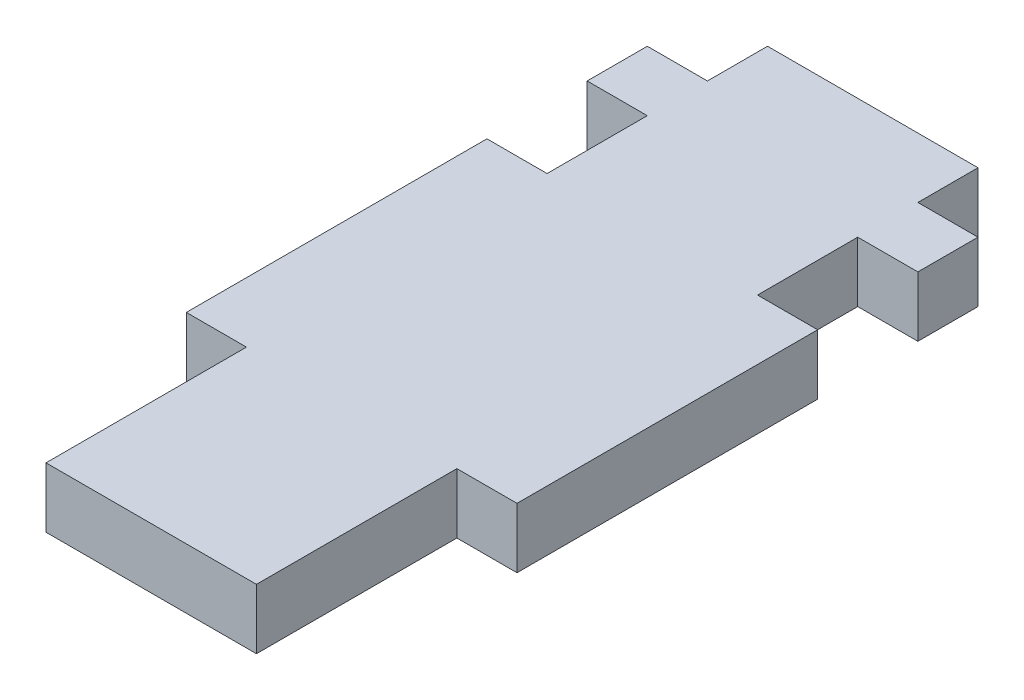
ISO-10303-21;
HEADER;
FILE_DESCRIPTION(('STEP AP214'),'2;1');
FILE_NAME('part.step','',(''),(''),'','','');
FILE_SCHEMA(('AUTOMOTIVE_DESIGN { 1 0 10303 214 1 1 1 1 }'));
ENDSEC;
DATA;
#1=APPLICATION_CONTEXT('core data for automotive mechanical design processes');
#2=APPLICATION_PROTOCOL_DEFINITION('international standard','automotive_design',2000,#1);
#3=PRODUCT_CONTEXT('',#1,'mechanical');
#4=PRODUCT('Part','Part','',(#3));
#5=PRODUCT_RELATED_PRODUCT_CATEGORY('part','',(#4));
#6=PRODUCT_DEFINITION_FORMATION('','',#4);
#7=PRODUCT_DEFINITION_CONTEXT('part definition',#1,'design');
#8=PRODUCT_DEFINITION('design','',#6,#7);
#9=PRODUCT_DEFINITION_SHAPE('','',#8);
#10=(LENGTH_UNIT() NAMED_UNIT(*) SI_UNIT(.MILLI.,.METRE.));
#11=(NAMED_UNIT(*) PLANE_ANGLE_UNIT() SI_UNIT($,.RADIAN.));
#12=(NAMED_UNIT(*) SI_UNIT($,.STERADIAN.) SOLID_ANGLE_UNIT());
#13=UNCERTAINTY_MEASURE_WITH_UNIT(LENGTH_MEASURE(1.E-05),#10,'distance_accuracy_value','');
#14=(GEOMETRIC_REPRESENTATION_CONTEXT(3) GLOBAL_UNCERTAINTY_ASSIGNED_CONTEXT((#13)) GLOBAL_UNIT_ASSIGNED_CONTEXT((#10,
#11,#12)) REPRESENTATION_CONTEXT('',''));
#15=CARTESIAN_POINT('',(0.,0.,0.));
#16=DIRECTION('',(0.,0.,1.));
#17=DIRECTION('',(1.,0.,0.));
#18=AXIS2_PLACEMENT_3D('',#15,#16,#17);
#19=CARTESIAN_POINT('',(13.5,3.,0.));
#20=DIRECTION('',(1.,0.,0.));
#21=DIRECTION('',(0.,0.,-1.));
#22=AXIS2_PLACEMENT_3D('',#19,#20,#21);
#23=PLANE('',#22);
#24=DIRECTION('',(0.,0.,1.));
#25=VECTOR('',#24,1.);
#26=CARTESIAN_POINT('',(13.5,0.,0.));
#27=LINE('',#26,#25);
#28=CARTESIAN_POINT('',(13.5,0.,0.));
#29=VERTEX_POINT('',#28);
#30=CARTESIAN_POINT('',(13.5,0.,5.));
#31=VERTEX_POINT('',#30);
#32=EDGE_CURVE('E217',#29,#31,#27,.T.);
#33=ORIENTED_EDGE('',*,*,#32,.F.);
#34=DIRECTION('',(0.,-1.,0.));
#35=VECTOR('',#34,1.);
#36=CARTESIAN_POINT('',(13.5,3.,0.));
#37=LINE('',#36,#35);
#38=CARTESIAN_POINT('',(13.5,3.,0.));
#39=VERTEX_POINT('',#38);
#40=EDGE_CURVE('E11',#39,#29,#37,.T.);
#41=ORIENTED_EDGE('',*,*,#40,.F.);
#42=DIRECTION('',(0.,0.,1.));
#43=VECTOR('',#42,1.);
#44=CARTESIAN_POINT('',(13.5,3.,0.));
#45=LINE('',#44,#43);
#46=CARTESIAN_POINT('',(13.5,3.,5.));
#47=VERTEX_POINT('',#46);
#48=EDGE_CURVE('E284',#39,#47,#45,.T.);
#49=ORIENTED_EDGE('',*,*,#48,.T.);
#50=DIRECTION('',(0.,-1.,0.));
#51=VECTOR('',#50,1.);
#52=CARTESIAN_POINT('',(13.5,3.,5.));
#53=LINE('',#52,#51);
#54=EDGE_CURVE('E134',#47,#31,#53,.T.);
#55=ORIENTED_EDGE('',*,*,#54,.T.);
#56=EDGE_LOOP('',(#33,#41,#49,#55));
#57=FACE_BOUND('',#56,.T.);
#58=ADVANCED_FACE('F47',(#57),#23,.T.);
#59=CARTESIAN_POINT('',(0.,3.,0.));
#60=DIRECTION('',(0.,0.,-1.));
#61=DIRECTION('',(-1.,0.,0.));
#62=AXIS2_PLACEMENT_3D('',#59,#60,#61);
#63=PLANE('',#62);
#64=DIRECTION('',(1.,0.,0.));
#65=VECTOR('',#64,1.);
#66=CARTESIAN_POINT('',(0.,0.,0.));
#67=LINE('',#66,#65);
#68=CARTESIAN_POINT('',(16.5,0.,0.));
#69=VERTEX_POINT('',#68);
#70=EDGE_CURVE('E221',#29,#69,#67,.T.);
#71=ORIENTED_EDGE('',*,*,#70,.T.);
#72=DIRECTION('',(0.,-1.,0.));
#73=VECTOR('',#72,1.);
#74=CARTESIAN_POINT('',(16.5,3.,0.));
#75=LINE('',#74,#73);
#76=CARTESIAN_POINT('',(16.5,3.,0.));
#77=VERTEX_POINT('',#76);
#78=EDGE_CURVE('E56',#77,#69,#75,.T.);
#79=ORIENTED_EDGE('',*,*,#78,.F.);
#80=DIRECTION('',(1.,0.,0.));
#81=VECTOR('',#80,1.);
#82=CARTESIAN_POINT('',(0.,3.,0.));
#83=LINE('',#82,#81);
#84=EDGE_CURVE('E364',#39,#77,#83,.T.);
#85=ORIENTED_EDGE('',*,*,#84,.F.);
#86=ORIENTED_EDGE('',*,*,#40,.T.);
#87=EDGE_LOOP('',(#71,#79,#85,#86));
#88=FACE_BOUND('',#87,.T.);
#89=ADVANCED_FACE('F414',(#88),#63,.F.);
#90=CARTESIAN_POINT('',(16.5,3.,0.));
#91=DIRECTION('',(-1.,0.,0.));
#92=DIRECTION('',(0.,0.,1.));
#93=AXIS2_PLACEMENT_3D('',#90,#91,#92);
#94=PLANE('',#93);
#95=DIRECTION('',(0.,0.,-1.));
#96=VECTOR('',#95,1.);
#97=CARTESIAN_POINT('',(16.5,0.,0.));
#98=LINE('',#97,#96);
#99=CARTESIAN_POINT('',(16.5,0.,-3.));
#100=VERTEX_POINT('',#99);
#101=EDGE_CURVE('E224',#69,#100,#98,.T.);
#102=ORIENTED_EDGE('',*,*,#101,.T.);
#103=DIRECTION('',(0.,-1.,0.));
#104=VECTOR('',#103,1.);
#105=CARTESIAN_POINT('',(16.5,3.,-3.));
#106=LINE('',#105,#104);
#107=CARTESIAN_POINT('',(16.5,3.,-3.));
#108=VERTEX_POINT('',#107);
#109=EDGE_CURVE('E333',#108,#100,#106,.T.);
#110=ORIENTED_EDGE('',*,*,#109,.F.);
#111=DIRECTION('',(0.,0.,-1.));
#112=VECTOR('',#111,1.);
#113=CARTESIAN_POINT('',(16.5,3.,0.));
#114=LINE('',#113,#112);
#115=EDGE_CURVE('E343',#77,#108,#114,.T.);
#116=ORIENTED_EDGE('',*,*,#115,.F.);
#117=ORIENTED_EDGE('',*,*,#78,.T.);
#118=EDGE_LOOP('',(#102,#110,#116,#117));
#119=FACE_BOUND('',#118,.T.);
#120=ADVANCED_FACE('F341',(#119),#94,.F.);
#121=CARTESIAN_POINT('',(0.,3.,-3.));
#122=DIRECTION('',(0.,0.,-1.));
#123=DIRECTION('',(-1.,0.,0.));
#124=AXIS2_PLACEMENT_3D('',#121,#122,#123);
#125=PLANE('',#124);
#126=DIRECTION('',(1.,0.,0.));
#127=VECTOR('',#126,1.);
#128=CARTESIAN_POINT('',(0.,0.,-3.));
#129=LINE('',#128,#127);
#130=CARTESIAN_POINT('',(13.5,0.,-3.));
#131=VERTEX_POINT('',#130);
#132=EDGE_CURVE('E229',#131,#100,#129,.T.);
#133=ORIENTED_EDGE('',*,*,#132,.F.);
#134=DIRECTION('',(0.,-1.,0.));
#135=VECTOR('',#134,1.);
#136=CARTESIAN_POINT('',(13.5,3.,-3.));
#137=LINE('',#136,#135);
#138=CARTESIAN_POINT('',(13.5,3.,-3.));
#139=VERTEX_POINT('',#138);
#140=EDGE_CURVE('E330',#139,#131,#137,.T.);
#141=ORIENTED_EDGE('',*,*,#140,.F.);
#142=DIRECTION('',(1.,0.,0.));
#143=VECTOR('',#142,1.);
#144=CARTESIAN_POINT('',(0.,3.,-3.));
#145=LINE('',#144,#143);
#146=EDGE_CURVE('E355',#139,#108,#145,.T.);
#147=ORIENTED_EDGE('',*,*,#146,.T.);
#148=ORIENTED_EDGE('',*,*,#109,.T.);
#149=EDGE_LOOP('',(#133,#141,#147,#148));
#150=FACE_BOUND('',#149,.T.);
#151=ADVANCED_FACE('F351',(#150),#125,.T.);
#152=CARTESIAN_POINT('',(13.5,3.,0.));
#153=DIRECTION('',(-1.,0.,0.));
#154=DIRECTION('',(0.,0.,1.));
#155=AXIS2_PLACEMENT_3D('',#152,#153,#154);
#156=PLANE('',#155);
#157=DIRECTION('',(0.,0.,-1.));
#158=VECTOR('',#157,1.);
#159=CARTESIAN_POINT('',(13.5,0.,0.));
#160=LINE('',#159,#158);
#161=CARTESIAN_POINT('',(13.5,0.,-6.));
#162=VERTEX_POINT('',#161);
#163=EDGE_CURVE('E233',#131,#162,#160,.T.);
#164=ORIENTED_EDGE('',*,*,#163,.T.);
#165=DIRECTION('',(0.,-1.,0.));
#166=VECTOR('',#165,1.);
#167=CARTESIAN_POINT('',(13.5,3.,-6.));
#168=LINE('',#167,#166);
#169=CARTESIAN_POINT('',(13.5,3.,-6.));
#170=VERTEX_POINT('',#169);
#171=EDGE_CURVE('E327',#170,#162,#168,.T.);
#172=ORIENTED_EDGE('',*,*,#171,.F.);
#173=DIRECTION('',(0.,0.,-1.));
#174=VECTOR('',#173,1.);
#175=CARTESIAN_POINT('',(13.5,3.,0.));
#176=LINE('',#175,#174);
#177=EDGE_CURVE('E357',#139,#170,#176,.T.);
#178=ORIENTED_EDGE('',*,*,#177,.F.);
#179=ORIENTED_EDGE('',*,*,#140,.T.);
#180=EDGE_LOOP('',(#164,#172,#178,#179));
#181=FACE_BOUND('',#180,.T.);
#182=ADVANCED_FACE('F614',(#181),#156,.F.);
#183=CARTESIAN_POINT('',(0.,3.,-6.));
#184=DIRECTION('',(0.,0.,-1.));
#185=DIRECTION('',(-1.,0.,0.));
#186=AXIS2_PLACEMENT_3D('',#183,#184,#185);
#187=PLANE('',#186);
#188=DIRECTION('',(1.,0.,0.));
#189=VECTOR('',#188,1.);
#190=CARTESIAN_POINT('',(0.,0.,-6.));
#191=LINE('',#190,#189);
#192=CARTESIAN_POINT('',(3.,0.,-6.));
#193=VERTEX_POINT('',#192);
#194=EDGE_CURVE('E238',#193,#162,#191,.T.);
#195=ORIENTED_EDGE('',*,*,#194,.F.);
#196=DIRECTION('',(0.,-1.,0.));
#197=VECTOR('',#196,1.);
#198=CARTESIAN_POINT('',(3.,3.,-6.));
#199=LINE('',#198,#197);
#200=CARTESIAN_POINT('',(3.,3.,-6.));
#201=VERTEX_POINT('',#200);
#202=EDGE_CURVE('E324',#201,#193,#199,.T.);
#203=ORIENTED_EDGE('',*,*,#202,.F.);
#204=DIRECTION('',(1.,0.,0.));
#205=VECTOR('',#204,1.);
#206=CARTESIAN_POINT('',(0.,3.,-6.));
#207=LINE('',#206,#205);
#208=EDGE_CURVE('E362',#201,#170,#207,.T.);
#209=ORIENTED_EDGE('',*,*,#208,.T.);
#210=ORIENTED_EDGE('',*,*,#171,.T.);
#211=EDGE_LOOP('',(#195,#203,#209,#210));
#212=FACE_BOUND('',#211,.T.);
#213=ADVANCED_FACE('F606',(#212),#187,.T.);
#214=CARTESIAN_POINT('',(3.,3.,0.));
#215=DIRECTION('',(-1.,0.,0.));
#216=DIRECTION('',(0.,0.,1.));
#217=AXIS2_PLACEMENT_3D('',#214,#215,#216);
#218=PLANE('',#217);
#219=DIRECTION('',(0.,0.,-1.));
#220=VECTOR('',#219,1.);
#221=CARTESIAN_POINT('',(3.,0.,0.));
#222=LINE('',#221,#220);
#223=CARTESIAN_POINT('',(3.,0.,-3.));
#224=VERTEX_POINT('',#223);
#225=EDGE_CURVE('E242',#224,#193,#222,.T.);
#226=ORIENTED_EDGE('',*,*,#225,.F.);
#227=DIRECTION('',(0.,-1.,0.));
#228=VECTOR('',#227,1.);
#229=CARTESIAN_POINT('',(3.,3.,-3.));
#230=LINE('',#229,#228);
#231=CARTESIAN_POINT('',(3.,3.,-3.));
#232=VERTEX_POINT('',#231);
#233=EDGE_CURVE('E321',#232,#224,#230,.T.);
#234=ORIENTED_EDGE('',*,*,#233,.F.);
#235=DIRECTION('',(0.,0.,-1.));
#236=VECTOR('',#235,1.);
#237=CARTESIAN_POINT('',(3.,3.,0.));
#238=LINE('',#237,#236);
#239=EDGE_CURVE('E369',#232,#201,#238,.T.);
#240=ORIENTED_EDGE('',*,*,#239,.T.);
#241=ORIENTED_EDGE('',*,*,#202,.T.);
#242=EDGE_LOOP('',(#226,#234,#240,#241));
#243=FACE_BOUND('',#242,.T.);
#244=ADVANCED_FACE('F598',(#243),#218,.T.);
#245=CARTESIAN_POINT('',(0.,0.,-3.));
#246=VERTEX_POINT('',#245);
#247=EDGE_CURVE('E234',#246,#224,#129,.T.);
#248=ORIENTED_EDGE('',*,*,#247,.F.);
#249=DIRECTION('',(0.,-1.,0.));
#250=VECTOR('',#249,1.);
#251=CARTESIAN_POINT('',(0.,3.,-3.));
#252=LINE('',#251,#250);
#253=CARTESIAN_POINT('',(0.,3.,-3.));
#254=VERTEX_POINT('',#253);
#255=EDGE_CURVE('E318',#254,#246,#252,.T.);
#256=ORIENTED_EDGE('',*,*,#255,.F.);
#257=EDGE_CURVE('E359',#254,#232,#145,.T.);
#258=ORIENTED_EDGE('',*,*,#257,.T.);
#259=ORIENTED_EDGE('',*,*,#233,.T.);
#260=EDGE_LOOP('',(#248,#256,#258,#259));
#261=FACE_BOUND('',#260,.T.);
#262=ADVANCED_FACE('F435',(#261),#125,.T.);
#263=CARTESIAN_POINT('',(0.,3.,0.));
#264=DIRECTION('',(-1.,0.,0.));
#265=DIRECTION('',(0.,0.,1.));
#266=AXIS2_PLACEMENT_3D('',#263,#264,#265);
#267=PLANE('',#266);
#268=DIRECTION('',(0.,0.,-1.));
#269=VECTOR('',#268,1.);
#270=CARTESIAN_POINT('',(0.,0.,0.));
#271=LINE('',#270,#269);
#272=CARTESIAN_POINT('',(0.,0.,0.));
#273=VERTEX_POINT('',#272);
#274=EDGE_CURVE('E246',#273,#246,#271,.T.);
#275=ORIENTED_EDGE('',*,*,#274,.F.);
#276=DIRECTION('',(0.,-1.,0.));
#277=VECTOR('',#276,1.);
#278=CARTESIAN_POINT('',(0.,3.,0.));
#279=LINE('',#278,#277);
#280=CARTESIAN_POINT('',(0.,3.,0.));
#281=VERTEX_POINT('',#280);
#282=EDGE_CURVE('E315',#281,#273,#279,.T.);
#283=ORIENTED_EDGE('',*,*,#282,.F.);
#284=DIRECTION('',(0.,0.,-1.));
#285=VECTOR('',#284,1.);
#286=CARTESIAN_POINT('',(0.,3.,0.));
#287=LINE('',#286,#285);
#288=EDGE_CURVE('E368',#281,#254,#287,.T.);
#289=ORIENTED_EDGE('',*,*,#288,.T.);
#290=ORIENTED_EDGE('',*,*,#255,.T.);
#291=EDGE_LOOP('',(#275,#283,#289,#290));
#292=FACE_BOUND('',#291,.T.);
#293=ADVANCED_FACE('F427',(#292),#267,.T.);
#294=CARTESIAN_POINT('',(3.,0.,0.));
#295=VERTEX_POINT('',#294);
#296=EDGE_CURVE('E225',#273,#295,#67,.T.);
#297=ORIENTED_EDGE('',*,*,#296,.T.);
#298=DIRECTION('',(0.,-1.,0.));
#299=VECTOR('',#298,1.);
#300=CARTESIAN_POINT('',(3.,3.,0.));
#301=LINE('',#300,#299);
#302=CARTESIAN_POINT('',(3.,3.,0.));
#303=VERTEX_POINT('',#302);
#304=EDGE_CURVE('E311',#303,#295,#301,.T.);
#305=ORIENTED_EDGE('',*,*,#304,.F.);
#306=EDGE_CURVE('E375',#281,#303,#83,.T.);
#307=ORIENTED_EDGE('',*,*,#306,.F.);
#308=ORIENTED_EDGE('',*,*,#282,.T.);
#309=EDGE_LOOP('',(#297,#305,#307,#308));
#310=FACE_BOUND('',#309,.T.);
#311=ADVANCED_FACE('F419',(#310),#63,.F.);
#312=CARTESIAN_POINT('',(3.,3.,0.));
#313=DIRECTION('',(1.,0.,0.));
#314=DIRECTION('',(0.,0.,-1.));
#315=AXIS2_PLACEMENT_3D('',#312,#313,#314);
#316=PLANE('',#315);
#317=DIRECTION('',(0.,0.,1.));
#318=VECTOR('',#317,1.);
#319=CARTESIAN_POINT('',(3.,0.,0.));
#320=LINE('',#319,#318);
#321=CARTESIAN_POINT('',(3.,0.,5.));
#322=VERTEX_POINT('',#321);
#323=EDGE_CURVE('E250',#295,#322,#320,.T.);
#324=ORIENTED_EDGE('',*,*,#323,.T.);
#325=DIRECTION('',(0.,-1.,0.));
#326=VECTOR('',#325,1.);
#327=CARTESIAN_POINT('',(3.,3.,5.));
#328=LINE('',#327,#326);
#329=CARTESIAN_POINT('',(3.,3.,5.));
#330=VERTEX_POINT('',#329);
#331=EDGE_CURVE('E308',#330,#322,#328,.T.);
#332=ORIENTED_EDGE('',*,*,#331,.F.);
#333=DIRECTION('',(0.,0.,1.));
#334=VECTOR('',#333,1.);
#335=CARTESIAN_POINT('',(3.,3.,0.));
#336=LINE('',#335,#334);
#337=EDGE_CURVE('E385',#303,#330,#336,.T.);
#338=ORIENTED_EDGE('',*,*,#337,.F.);
#339=ORIENTED_EDGE('',*,*,#304,.T.);
#340=EDGE_LOOP('',(#324,#332,#338,#339));
#341=FACE_BOUND('',#340,.T.);
#342=ADVANCED_FACE('F426',(#341),#316,.F.);
#343=CARTESIAN_POINT('',(0.,3.,5.));
#344=DIRECTION('',(0.,0.,-1.));
#345=DIRECTION('',(-1.,0.,0.));
#346=AXIS2_PLACEMENT_3D('',#343,#344,#345);
#347=PLANE('',#346);
#348=DIRECTION('',(1.,0.,0.));
#349=VECTOR('',#348,1.);
#350=CARTESIAN_POINT('',(0.,0.,5.));
#351=LINE('',#350,#349);
#352=CARTESIAN_POINT('',(0.,0.,5.));
#353=VERTEX_POINT('',#352);
#354=EDGE_CURVE('E254',#353,#322,#351,.T.);
#355=ORIENTED_EDGE('',*,*,#354,.F.);
#356=DIRECTION('',(0.,-1.,0.));
#357=VECTOR('',#356,1.);
#358=CARTESIAN_POINT('',(0.,3.,5.));
#359=LINE('',#358,#357);
#360=CARTESIAN_POINT('',(0.,3.,5.));
#361=VERTEX_POINT('',#360);
#362=EDGE_CURVE('E305',#361,#353,#359,.T.);
#363=ORIENTED_EDGE('',*,*,#362,.F.);
#364=DIRECTION('',(1.,0.,0.));
#365=VECTOR('',#364,1.);
#366=CARTESIAN_POINT('',(0.,3.,5.));
#367=LINE('',#366,#365);
#368=EDGE_CURVE('E388',#361,#330,#367,.T.);
#369=ORIENTED_EDGE('',*,*,#368,.T.);
#370=ORIENTED_EDGE('',*,*,#331,.T.);
#371=EDGE_LOOP('',(#355,#363,#369,#370));
#372=FACE_BOUND('',#371,.T.);
#373=ADVANCED_FACE('F433',(#372),#347,.T.);
#374=CARTESIAN_POINT('',(0.,3.,0.));
#375=DIRECTION('',(1.,0.,0.));
#376=DIRECTION('',(0.,0.,-1.));
#377=AXIS2_PLACEMENT_3D('',#374,#375,#376);
#378=PLANE('',#377);
#379=DIRECTION('',(0.,0.,1.));
#380=VECTOR('',#379,1.);
#381=CARTESIAN_POINT('',(0.,0.,0.));
#382=LINE('',#381,#380);
#383=CARTESIAN_POINT('',(0.,0.,20.));
#384=VERTEX_POINT('',#383);
#385=EDGE_CURVE('E258',#353,#384,#382,.T.);
#386=ORIENTED_EDGE('',*,*,#385,.T.);
#387=DIRECTION('',(0.,-1.,0.));
#388=VECTOR('',#387,1.);
#389=CARTESIAN_POINT('',(0.,3.,20.));
#390=LINE('',#389,#388);
#391=CARTESIAN_POINT('',(0.,3.,20.));
#392=VERTEX_POINT('',#391);
#393=EDGE_CURVE('E301',#392,#384,#390,.T.);
#394=ORIENTED_EDGE('',*,*,#393,.F.);
#395=DIRECTION('',(0.,0.,1.));
#396=VECTOR('',#395,1.);
#397=CARTESIAN_POINT('',(0.,3.,0.));
#398=LINE('',#397,#396);
#399=EDGE_CURVE('E392',#361,#392,#398,.T.);
#400=ORIENTED_EDGE('',*,*,#399,.F.);
#401=ORIENTED_EDGE('',*,*,#362,.T.);
#402=EDGE_LOOP('',(#386,#394,#400,#401));
#403=FACE_BOUND('',#402,.T.);
#404=ADVANCED_FACE('F454',(#403),#378,.F.);
#405=CARTESIAN_POINT('',(0.,3.,20.));
#406=DIRECTION('',(0.,0.,-1.));
#407=DIRECTION('',(-1.,0.,0.));
#408=AXIS2_PLACEMENT_3D('',#405,#406,#407);
#409=PLANE('',#408);
#410=DIRECTION('',(1.,0.,0.));
#411=VECTOR('',#410,1.);
#412=CARTESIAN_POINT('',(0.,0.,20.));
#413=LINE('',#412,#411);
#414=CARTESIAN_POINT('',(3.,0.,20.));
#415=VERTEX_POINT('',#414);
#416=EDGE_CURVE('E261',#384,#415,#413,.T.);
#417=ORIENTED_EDGE('',*,*,#416,.T.);
#418=DIRECTION('',(0.,-1.,0.));
#419=VECTOR('',#418,1.);
#420=CARTESIAN_POINT('',(3.,3.,20.));
#421=LINE('',#420,#419);
#422=CARTESIAN_POINT('',(3.,3.,20.));
#423=VERTEX_POINT('',#422);
#424=EDGE_CURVE('E298',#423,#415,#421,.T.);
#425=ORIENTED_EDGE('',*,*,#424,.F.);
#426=DIRECTION('',(1.,0.,0.));
#427=VECTOR('',#426,1.);
#428=CARTESIAN_POINT('',(0.,3.,20.));
#429=LINE('',#428,#427);
#430=EDGE_CURVE('E395',#392,#423,#429,.T.);
#431=ORIENTED_EDGE('',*,*,#430,.F.);
#432=ORIENTED_EDGE('',*,*,#393,.T.);
#433=EDGE_LOOP('',(#417,#425,#431,#432));
#434=FACE_BOUND('',#433,.T.);
#435=ADVANCED_FACE('F456',(#434),#409,.F.);
#436=CARTESIAN_POINT('',(3.,3.,0.));
#437=DIRECTION('',(-1.,0.,0.));
#438=DIRECTION('',(0.,0.,1.));
#439=AXIS2_PLACEMENT_3D('',#436,#437,#438);
#440=PLANE('',#439);
#441=DIRECTION('',(0.,0.,-1.));
#442=VECTOR('',#441,1.);
#443=CARTESIAN_POINT('',(3.,0.,0.));
#444=LINE('',#443,#442);
#445=CARTESIAN_POINT('',(3.,0.,30.));
#446=VERTEX_POINT('',#445);
#447=EDGE_CURVE('E265',#446,#415,#444,.T.);
#448=ORIENTED_EDGE('',*,*,#447,.F.);
#449=DIRECTION('',(0.,-1.,0.));
#450=VECTOR('',#449,1.);
#451=CARTESIAN_POINT('',(3.,3.,30.));
#452=LINE('',#451,#450);
#453=CARTESIAN_POINT('',(3.,3.,30.));
#454=VERTEX_POINT('',#453);
#455=EDGE_CURVE('E295',#454,#446,#452,.T.);
#456=ORIENTED_EDGE('',*,*,#455,.F.);
#457=DIRECTION('',(0.,0.,-1.));
#458=VECTOR('',#457,1.);
#459=CARTESIAN_POINT('',(3.,3.,0.));
#460=LINE('',#459,#458);
#461=EDGE_CURVE('E398',#454,#423,#460,.T.);
#462=ORIENTED_EDGE('',*,*,#461,.T.);
#463=ORIENTED_EDGE('',*,*,#424,.T.);
#464=EDGE_LOOP('',(#448,#456,#462,#463));
#465=FACE_BOUND('',#464,.T.);
#466=ADVANCED_FACE('F459',(#465),#440,.T.);
#467=CARTESIAN_POINT('',(0.,3.,30.));
#468=DIRECTION('',(0.,0.,-1.));
#469=DIRECTION('',(-1.,0.,0.));
#470=AXIS2_PLACEMENT_3D('',#467,#468,#469);
#471=PLANE('',#470);
#472=DIRECTION('',(1.,0.,0.));
#473=VECTOR('',#472,1.);
#474=CARTESIAN_POINT('',(0.,0.,30.));
#475=LINE('',#474,#473);
#476=CARTESIAN_POINT('',(13.5,0.,30.));
#477=VERTEX_POINT('',#476);
#478=EDGE_CURVE('E269',#446,#477,#475,.T.);
#479=ORIENTED_EDGE('',*,*,#478,.T.);
#480=DIRECTION('',(0.,-1.,0.));
#481=VECTOR('',#480,1.);
#482=CARTESIAN_POINT('',(13.5,3.,30.));
#483=LINE('',#482,#481);
#484=CARTESIAN_POINT('',(13.5,3.,30.));
#485=VERTEX_POINT('',#484);
#486=EDGE_CURVE('E291',#485,#477,#483,.T.);
#487=ORIENTED_EDGE('',*,*,#486,.F.);
#488=DIRECTION('',(1.,0.,0.));
#489=VECTOR('',#488,1.);
#490=CARTESIAN_POINT('',(0.,3.,30.));
#491=LINE('',#490,#489);
#492=EDGE_CURVE('E402',#454,#485,#491,.T.);
#493=ORIENTED_EDGE('',*,*,#492,.F.);
#494=ORIENTED_EDGE('',*,*,#455,.T.);
#495=EDGE_LOOP('',(#479,#487,#493,#494));
#496=FACE_BOUND('',#495,.T.);
#497=ADVANCED_FACE('F463',(#496),#471,.F.);
#498=CARTESIAN_POINT('',(13.5,3.,0.));
#499=DIRECTION('',(-1.,0.,0.));
#500=DIRECTION('',(0.,0.,1.));
#501=AXIS2_PLACEMENT_3D('',#498,#499,#500);
#502=PLANE('',#501);
#503=DIRECTION('',(0.,0.,-1.));
#504=VECTOR('',#503,1.);
#505=CARTESIAN_POINT('',(13.5,0.,0.));
#506=LINE('',#505,#504);
#507=CARTESIAN_POINT('',(13.5,0.,20.));
#508=VERTEX_POINT('',#507);
#509=EDGE_CURVE('E272',#477,#508,#506,.T.);
#510=ORIENTED_EDGE('',*,*,#509,.T.);
#511=DIRECTION('',(0.,-1.,0.));
#512=VECTOR('',#511,1.);
#513=CARTESIAN_POINT('',(13.5,3.,20.));
#514=LINE('',#513,#512);
#515=CARTESIAN_POINT('',(13.5,3.,20.));
#516=VERTEX_POINT('',#515);
#517=EDGE_CURVE('E201',#516,#508,#514,.T.);
#518=ORIENTED_EDGE('',*,*,#517,.F.);
#519=DIRECTION('',(0.,0.,-1.));
#520=VECTOR('',#519,1.);
#521=CARTESIAN_POINT('',(13.5,3.,0.));
#522=LINE('',#521,#520);
#523=EDGE_CURVE('E206',#485,#516,#522,.T.);
#524=ORIENTED_EDGE('',*,*,#523,.F.);
#525=ORIENTED_EDGE('',*,*,#486,.T.);
#526=EDGE_LOOP('',(#510,#518,#524,#525));
#527=FACE_BOUND('',#526,.T.);
#528=ADVANCED_FACE('F467',(#527),#502,.F.);
#529=CARTESIAN_POINT('',(0.,3.,20.));
#530=DIRECTION('',(0.,0.,1.));
#531=DIRECTION('',(1.,0.,0.));
#532=AXIS2_PLACEMENT_3D('',#529,#530,#531);
#533=PLANE('',#532);
#534=DIRECTION('',(-1.,0.,0.));
#535=VECTOR('',#534,1.);
#536=CARTESIAN_POINT('',(0.,0.,20.));
#537=LINE('',#536,#535);
#538=CARTESIAN_POINT('',(16.5,0.,20.));
#539=VERTEX_POINT('',#538);
#540=EDGE_CURVE('E195',#539,#508,#537,.T.);
#541=ORIENTED_EDGE('',*,*,#540,.F.);
#542=DIRECTION('',(0.,-1.,0.));
#543=VECTOR('',#542,1.);
#544=CARTESIAN_POINT('',(16.5,3.,20.));
#545=LINE('',#544,#543);
#546=CARTESIAN_POINT('',(16.5,3.,20.));
#547=VERTEX_POINT('',#546);
#548=EDGE_CURVE('E190',#547,#539,#545,.T.);
#549=ORIENTED_EDGE('',*,*,#548,.F.);
#550=DIRECTION('',(-1.,0.,0.));
#551=VECTOR('',#550,1.);
#552=CARTESIAN_POINT('',(0.,3.,20.));
#553=LINE('',#552,#551);
#554=EDGE_CURVE('E193',#547,#516,#553,.T.);
#555=ORIENTED_EDGE('',*,*,#554,.T.);
#556=ORIENTED_EDGE('',*,*,#517,.T.);
#557=EDGE_LOOP('',(#541,#549,#555,#556));
#558=FACE_BOUND('',#557,.T.);
#559=ADVANCED_FACE('F192',(#558),#533,.T.);
#560=CARTESIAN_POINT('',(16.5,3.,0.));
#561=DIRECTION('',(1.,0.,0.));
#562=DIRECTION('',(0.,0.,-1.));
#563=AXIS2_PLACEMENT_3D('',#560,#561,#562);
#564=PLANE('',#563);
#565=DIRECTION('',(0.,0.,1.));
#566=VECTOR('',#565,1.);
#567=CARTESIAN_POINT('',(16.5,0.,0.));
#568=LINE('',#567,#566);
#569=CARTESIAN_POINT('',(16.5,0.,5.));
#570=VERTEX_POINT('',#569);
#571=EDGE_CURVE('E278',#570,#539,#568,.T.);
#572=ORIENTED_EDGE('',*,*,#571,.F.);
#573=DIRECTION('',(0.,-1.,0.));
#574=VECTOR('',#573,1.);
#575=CARTESIAN_POINT('',(16.5,3.,5.));
#576=LINE('',#575,#574);
#577=CARTESIAN_POINT('',(16.5,3.,5.));
#578=VERTEX_POINT('',#577);
#579=EDGE_CURVE('E127',#578,#570,#576,.T.);
#580=ORIENTED_EDGE('',*,*,#579,.F.);
#581=DIRECTION('',(0.,0.,1.));
#582=VECTOR('',#581,1.);
#583=CARTESIAN_POINT('',(16.5,3.,0.));
#584=LINE('',#583,#582);
#585=EDGE_CURVE('E204',#578,#547,#584,.T.);
#586=ORIENTED_EDGE('',*,*,#585,.T.);
#587=ORIENTED_EDGE('',*,*,#548,.T.);
#588=EDGE_LOOP('',(#572,#580,#586,#587));
#589=FACE_BOUND('',#588,.T.);
#590=ADVANCED_FACE('F210',(#589),#564,.T.);
#591=CARTESIAN_POINT('',(0.,3.,5.));
#592=DIRECTION('',(0.,0.,1.));
#593=DIRECTION('',(1.,0.,0.));
#594=AXIS2_PLACEMENT_3D('',#591,#592,#593);
#595=PLANE('',#594);
#596=DIRECTION('',(-1.,0.,0.));
#597=VECTOR('',#596,1.);
#598=CARTESIAN_POINT('',(0.,0.,5.));
#599=LINE('',#598,#597);
#600=EDGE_CURVE('E281',#570,#31,#599,.T.);
#601=ORIENTED_EDGE('',*,*,#600,.T.);
#602=ORIENTED_EDGE('',*,*,#54,.F.);
#603=DIRECTION('',(-1.,0.,0.));
#604=VECTOR('',#603,1.);
#605=CARTESIAN_POINT('',(0.,3.,5.));
#606=LINE('',#605,#604);
#607=EDGE_CURVE('E64',#578,#47,#606,.T.);
#608=ORIENTED_EDGE('',*,*,#607,.F.);
#609=ORIENTED_EDGE('',*,*,#579,.T.);
#610=EDGE_LOOP('',(#601,#602,#608,#609));
#611=FACE_BOUND('',#610,.T.);
#612=ADVANCED_FACE('F468',(#611),#595,.F.);
#613=CARTESIAN_POINT('',(0.,3.,0.));
#614=DIRECTION('',(0.,1.,0.));
#615=DIRECTION('',(0.,0.,1.));
#616=AXIS2_PLACEMENT_3D('',#613,#614,#615);
#617=PLANE('',#616);
#618=ORIENTED_EDGE('',*,*,#48,.F.);
#619=ORIENTED_EDGE('',*,*,#84,.T.);
#620=ORIENTED_EDGE('',*,*,#115,.T.);
#621=ORIENTED_EDGE('',*,*,#146,.F.);
#622=ORIENTED_EDGE('',*,*,#177,.T.);
#623=ORIENTED_EDGE('',*,*,#208,.F.);
#624=ORIENTED_EDGE('',*,*,#239,.F.);
#625=ORIENTED_EDGE('',*,*,#257,.F.);
#626=ORIENTED_EDGE('',*,*,#288,.F.);
#627=ORIENTED_EDGE('',*,*,#306,.T.);
#628=ORIENTED_EDGE('',*,*,#337,.T.);
#629=ORIENTED_EDGE('',*,*,#368,.F.);
#630=ORIENTED_EDGE('',*,*,#399,.T.);
#631=ORIENTED_EDGE('',*,*,#430,.T.);
#632=ORIENTED_EDGE('',*,*,#461,.F.);
#633=ORIENTED_EDGE('',*,*,#492,.T.);
#634=ORIENTED_EDGE('',*,*,#523,.T.);
#635=ORIENTED_EDGE('',*,*,#554,.F.);
#636=ORIENTED_EDGE('',*,*,#585,.F.);
#637=ORIENTED_EDGE('',*,*,#607,.T.);
#638=EDGE_LOOP('',(#618,#619,#620,#621,#622,#623,#624,#625,#626,#627,#628,#629,#630,#631,#632,
#633,#634,#635,#636,#637));
#639=FACE_BOUND('',#638,.T.);
#640=ADVANCED_FACE('F203',(#639),#617,.T.);
#641=CARTESIAN_POINT('',(0.,0.,0.));
#642=DIRECTION('',(0.,1.,0.));
#643=DIRECTION('',(0.,0.,1.));
#644=AXIS2_PLACEMENT_3D('',#641,#642,#643);
#645=PLANE('',#644);
#646=ORIENTED_EDGE('',*,*,#32,.T.);
#647=ORIENTED_EDGE('',*,*,#600,.F.);
#648=ORIENTED_EDGE('',*,*,#571,.T.);
#649=ORIENTED_EDGE('',*,*,#540,.T.);
#650=ORIENTED_EDGE('',*,*,#509,.F.);
#651=ORIENTED_EDGE('',*,*,#478,.F.);
#652=ORIENTED_EDGE('',*,*,#447,.T.);
#653=ORIENTED_EDGE('',*,*,#416,.F.);
#654=ORIENTED_EDGE('',*,*,#385,.F.);
#655=ORIENTED_EDGE('',*,*,#354,.T.);
#656=ORIENTED_EDGE('',*,*,#323,.F.);
#657=ORIENTED_EDGE('',*,*,#296,.F.);
#658=ORIENTED_EDGE('',*,*,#274,.T.);
#659=ORIENTED_EDGE('',*,*,#247,.T.);
#660=ORIENTED_EDGE('',*,*,#225,.T.);
#661=ORIENTED_EDGE('',*,*,#194,.T.);
#662=ORIENTED_EDGE('',*,*,#163,.F.);
#663=ORIENTED_EDGE('',*,*,#132,.T.);
#664=ORIENTED_EDGE('',*,*,#101,.F.);
#665=ORIENTED_EDGE('',*,*,#70,.F.);
#666=EDGE_LOOP('',(#646,#647,#648,#649,#650,#651,#652,#653,#654,#655,#656,#657,#658,#659,#660,
#661,#662,#663,#664,#665));
#667=FACE_BOUND('',#666,.T.);
#668=ADVANCED_FACE('F347',(#667),#645,.F.);
#669=CLOSED_SHELL('',(#58,#89,#120,#151,#182,#213,#244,#262,#293,#311,#342,#373,#404,#435,#466,
#497,#528,#559,#590,#612,#640,#668));
#670=MANIFOLD_SOLID_BREP('B2',#669);
#671=ADVANCED_BREP_SHAPE_REPRESENTATION('',(#18,#670),#14);
#672=SHAPE_DEFINITION_REPRESENTATION(#9,#671);
ENDSEC;
END-ISO-10303-21;
